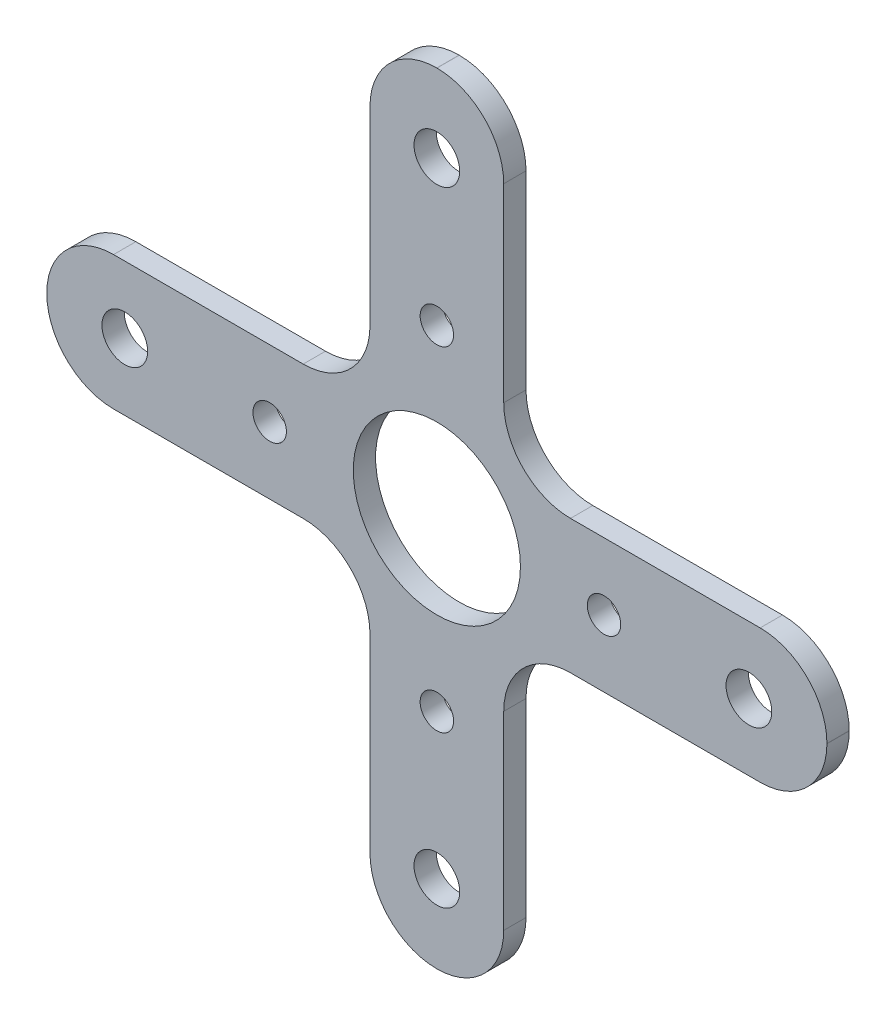
ISO-10303-21;
HEADER;
FILE_DESCRIPTION(('STEP AP214'),'2;1');
FILE_NAME('part.step','',(''),(''),'','','');
FILE_SCHEMA(('AUTOMOTIVE_DESIGN { 1 0 10303 214 1 1 1 1 }'));
ENDSEC;
DATA;
#1=APPLICATION_CONTEXT('core data for automotive mechanical design processes');
#2=APPLICATION_PROTOCOL_DEFINITION('international standard','automotive_design',2000,#1);
#3=PRODUCT_CONTEXT('',#1,'mechanical');
#4=PRODUCT('Part','Part','',(#3));
#5=PRODUCT_RELATED_PRODUCT_CATEGORY('part','',(#4));
#6=PRODUCT_DEFINITION_FORMATION('','',#4);
#7=PRODUCT_DEFINITION_CONTEXT('part definition',#1,'design');
#8=PRODUCT_DEFINITION('design','',#6,#7);
#9=PRODUCT_DEFINITION_SHAPE('','',#8);
#10=(LENGTH_UNIT() NAMED_UNIT(*) SI_UNIT(.MILLI.,.METRE.));
#11=(NAMED_UNIT(*) PLANE_ANGLE_UNIT() SI_UNIT($,.RADIAN.));
#12=(NAMED_UNIT(*) SI_UNIT($,.STERADIAN.) SOLID_ANGLE_UNIT());
#13=UNCERTAINTY_MEASURE_WITH_UNIT(LENGTH_MEASURE(1.E-05),#10,'distance_accuracy_value','');
#14=(GEOMETRIC_REPRESENTATION_CONTEXT(3) GLOBAL_UNCERTAINTY_ASSIGNED_CONTEXT((#13)) GLOBAL_UNIT_ASSIGNED_CONTEXT((#10,
#11,#12)) REPRESENTATION_CONTEXT('',''));
#15=CARTESIAN_POINT('',(0.,0.,0.));
#16=DIRECTION('',(0.,0.,1.));
#17=DIRECTION('',(1.,0.,0.));
#18=AXIS2_PLACEMENT_3D('',#15,#16,#17);
#19=CARTESIAN_POINT('',(-0.00999999999999612,29.01,2.));
#20=DIRECTION('',(0.,0.,1.));
#21=DIRECTION('',(1.,0.,0.));
#22=AXIS2_PLACEMENT_3D('',#19,#20,#21);
#23=PLANE('',#22);
#24=CARTESIAN_POINT('',(-15.,0.,2.));
#25=DIRECTION('',(0.,0.,1.));
#26=DIRECTION('',(1.,0.,0.));
#27=AXIS2_PLACEMENT_3D('',#24,#25,#26);
#28=CIRCLE('',#27,1.5);
#29=CARTESIAN_POINT('',(-13.5,0.,2.));
#30=VERTEX_POINT('',#29);
#31=EDGE_CURVE('E473',#30,#30,#28,.T.);
#32=ORIENTED_EDGE('',*,*,#31,.F.);
#33=EDGE_LOOP('',(#32));
#34=FACE_BOUND('',#33,.T.);
#35=CARTESIAN_POINT('',(0.,15.,2.));
#36=DIRECTION('',(0.,0.,1.));
#37=DIRECTION('',(1.,0.,0.));
#38=AXIS2_PLACEMENT_3D('',#35,#36,#37);
#39=CIRCLE('',#38,1.5);
#40=CARTESIAN_POINT('',(1.5,15.,2.));
#41=VERTEX_POINT('',#40);
#42=EDGE_CURVE('E485',#41,#41,#39,.T.);
#43=ORIENTED_EDGE('',*,*,#42,.F.);
#44=EDGE_LOOP('',(#43));
#45=FACE_BOUND('',#44,.T.);
#46=CARTESIAN_POINT('',(28.,0.,2.));
#47=DIRECTION('',(0.,0.,1.));
#48=DIRECTION('',(-1.,0.,0.));
#49=AXIS2_PLACEMENT_3D('',#46,#47,#48);
#50=CIRCLE('',#49,2.05);
#51=CARTESIAN_POINT('',(25.95,0.,2.));
#52=VERTEX_POINT('',#51);
#53=EDGE_CURVE('E497',#52,#52,#50,.T.);
#54=ORIENTED_EDGE('',*,*,#53,.F.);
#55=EDGE_LOOP('',(#54));
#56=FACE_BOUND('',#55,.T.);
#57=CARTESIAN_POINT('',(-28.,0.,2.));
#58=DIRECTION('',(0.,0.,1.));
#59=DIRECTION('',(1.,0.,0.));
#60=AXIS2_PLACEMENT_3D('',#57,#58,#59);
#61=CIRCLE('',#60,2.05);
#62=CARTESIAN_POINT('',(-25.95,0.,2.));
#63=VERTEX_POINT('',#62);
#64=EDGE_CURVE('E509',#63,#63,#61,.T.);
#65=ORIENTED_EDGE('',*,*,#64,.F.);
#66=EDGE_LOOP('',(#65));
#67=FACE_BOUND('',#66,.T.);
#68=CARTESIAN_POINT('',(-0.00999999999999612,29.01,2.));
#69=DIRECTION('',(0.,0.,1.));
#70=DIRECTION('',(1.,0.,0.));
#71=AXIS2_PLACEMENT_3D('',#68,#69,#70);
#72=CIRCLE('',#71,5.99);
#73=CARTESIAN_POINT('',(-0.00999999999999612,35.,2.));
#74=VERTEX_POINT('',#73);
#75=CARTESIAN_POINT('',(-6.,29.01,2.));
#76=VERTEX_POINT('',#75);
#77=EDGE_CURVE('E279',#74,#76,#72,.T.);
#78=ORIENTED_EDGE('',*,*,#77,.T.);
#79=DIRECTION('',(0.,-1.,0.));
#80=VECTOR('',#79,1.);
#81=CARTESIAN_POINT('',(-6.,11.99,2.));
#82=LINE('',#81,#80);
#83=CARTESIAN_POINT('',(-6.,11.99,2.));
#84=VERTEX_POINT('',#83);
#85=EDGE_CURVE('E147',#76,#84,#82,.T.);
#86=ORIENTED_EDGE('',*,*,#85,.T.);
#87=CARTESIAN_POINT('',(-11.99,11.99,2.));
#88=DIRECTION('',(0.,0.,-1.));
#89=DIRECTION('',(1.,0.,0.));
#90=AXIS2_PLACEMENT_3D('',#87,#88,#89);
#91=CIRCLE('',#90,5.99);
#92=CARTESIAN_POINT('',(-11.99,6.,2.));
#93=VERTEX_POINT('',#92);
#94=EDGE_CURVE('E342',#84,#93,#91,.T.);
#95=ORIENTED_EDGE('',*,*,#94,.T.);
#96=DIRECTION('',(-1.,0.,0.));
#97=VECTOR('',#96,1.);
#98=CARTESIAN_POINT('',(-29.01,6.,2.));
#99=LINE('',#98,#97);
#100=CARTESIAN_POINT('',(-29.01,6.,2.));
#101=VERTEX_POINT('',#100);
#102=EDGE_CURVE('E361',#93,#101,#99,.T.);
#103=ORIENTED_EDGE('',*,*,#102,.T.);
#104=CARTESIAN_POINT('',(-29.01,0.00999999999999959,2.));
#105=DIRECTION('',(0.,0.,1.));
#106=DIRECTION('',(-1.,0.,0.));
#107=AXIS2_PLACEMENT_3D('',#104,#105,#106);
#108=CIRCLE('',#107,5.99);
#109=CARTESIAN_POINT('',(-35.,0.00999999999999959,2.));
#110=VERTEX_POINT('',#109);
#111=EDGE_CURVE('E358',#101,#110,#108,.T.);
#112=ORIENTED_EDGE('',*,*,#111,.T.);
#113=DIRECTION('',(3.46944695195361E-13,-1.,0.));
#114=VECTOR('',#113,1.);
#115=CARTESIAN_POINT('',(-35.,-0.0100000000000005,2.));
#116=LINE('',#115,#114);
#117=CARTESIAN_POINT('',(-35.,-0.0100000000000005,2.));
#118=VERTEX_POINT('',#117);
#119=EDGE_CURVE('E360',#110,#118,#116,.T.);
#120=ORIENTED_EDGE('',*,*,#119,.T.);
#121=CARTESIAN_POINT('',(-29.01,-0.0100000000000005,2.));
#122=DIRECTION('',(0.,0.,1.));
#123=DIRECTION('',(-1.,0.,0.));
#124=AXIS2_PLACEMENT_3D('',#121,#122,#123);
#125=CIRCLE('',#124,5.99);
#126=CARTESIAN_POINT('',(-29.01,-6.,2.));
#127=VERTEX_POINT('',#126);
#128=EDGE_CURVE('E363',#118,#127,#125,.T.);
#129=ORIENTED_EDGE('',*,*,#128,.T.);
#130=DIRECTION('',(1.,0.,0.));
#131=VECTOR('',#130,1.);
#132=CARTESIAN_POINT('',(-29.01,-6.,2.));
#133=LINE('',#132,#131);
#134=CARTESIAN_POINT('',(-11.99,-6.,2.));
#135=VERTEX_POINT('',#134);
#136=EDGE_CURVE('E369',#127,#135,#133,.T.);
#137=ORIENTED_EDGE('',*,*,#136,.T.);
#138=CARTESIAN_POINT('',(-11.99,-11.99,2.));
#139=DIRECTION('',(0.,0.,-1.));
#140=DIRECTION('',(1.,0.,0.));
#141=AXIS2_PLACEMENT_3D('',#138,#139,#140);
#142=CIRCLE('',#141,5.99);
#143=CARTESIAN_POINT('',(-6.,-11.99,2.));
#144=VERTEX_POINT('',#143);
#145=EDGE_CURVE('E371',#135,#144,#142,.T.);
#146=ORIENTED_EDGE('',*,*,#145,.T.);
#147=DIRECTION('',(0.,-1.,0.));
#148=VECTOR('',#147,1.);
#149=CARTESIAN_POINT('',(-6.,-29.01,2.));
#150=LINE('',#149,#148);
#151=CARTESIAN_POINT('',(-6.,-29.01,2.));
#152=VERTEX_POINT('',#151);
#153=EDGE_CURVE('E373',#144,#152,#150,.T.);
#154=ORIENTED_EDGE('',*,*,#153,.T.);
#155=CARTESIAN_POINT('',(-0.00999999999999612,-29.01,2.));
#156=DIRECTION('',(0.,0.,1.));
#157=DIRECTION('',(-1.,0.,0.));
#158=AXIS2_PLACEMENT_3D('',#155,#156,#157);
#159=CIRCLE('',#158,5.99);
#160=CARTESIAN_POINT('',(-0.00999999999999612,-35.,2.));
#161=VERTEX_POINT('',#160);
#162=EDGE_CURVE('E375',#152,#161,#159,.T.);
#163=ORIENTED_EDGE('',*,*,#162,.T.);
#164=DIRECTION('',(1.,0.,0.));
#165=VECTOR('',#164,1.);
#166=CARTESIAN_POINT('',(-0.00999999999999612,-35.,2.));
#167=LINE('',#166,#165);
#168=CARTESIAN_POINT('',(0.010000000000002,-35.,2.));
#169=VERTEX_POINT('',#168);
#170=EDGE_CURVE('E377',#161,#169,#167,.T.);
#171=ORIENTED_EDGE('',*,*,#170,.T.);
#172=CARTESIAN_POINT('',(0.0100000000000031,-29.01,2.));
#173=DIRECTION('',(0.,0.,1.));
#174=DIRECTION('',(1.,0.,0.));
#175=AXIS2_PLACEMENT_3D('',#172,#173,#174);
#176=CIRCLE('',#175,5.99);
#177=CARTESIAN_POINT('',(6.,-29.01,2.));
#178=VERTEX_POINT('',#177);
#179=EDGE_CURVE('E379',#169,#178,#176,.T.);
#180=ORIENTED_EDGE('',*,*,#179,.T.);
#181=DIRECTION('',(0.,1.,0.));
#182=VECTOR('',#181,1.);
#183=CARTESIAN_POINT('',(6.,-29.01,2.));
#184=LINE('',#183,#182);
#185=CARTESIAN_POINT('',(6.,-11.99,2.));
#186=VERTEX_POINT('',#185);
#187=EDGE_CURVE('E381',#178,#186,#184,.T.);
#188=ORIENTED_EDGE('',*,*,#187,.T.);
#189=CARTESIAN_POINT('',(11.99,-11.99,2.));
#190=DIRECTION('',(0.,0.,-1.));
#191=DIRECTION('',(-1.,0.,0.));
#192=AXIS2_PLACEMENT_3D('',#189,#190,#191);
#193=CIRCLE('',#192,5.99);
#194=CARTESIAN_POINT('',(11.99,-6.,2.));
#195=VERTEX_POINT('',#194);
#196=EDGE_CURVE('E383',#186,#195,#193,.T.);
#197=ORIENTED_EDGE('',*,*,#196,.T.);
#198=DIRECTION('',(1.,0.,0.));
#199=VECTOR('',#198,1.);
#200=CARTESIAN_POINT('',(11.99,-6.,2.));
#201=LINE('',#200,#199);
#202=CARTESIAN_POINT('',(29.01,-6.,2.));
#203=VERTEX_POINT('',#202);
#204=EDGE_CURVE('E385',#195,#203,#201,.T.);
#205=ORIENTED_EDGE('',*,*,#204,.T.);
#206=CARTESIAN_POINT('',(29.01,-0.0100000000000005,2.));
#207=DIRECTION('',(0.,0.,1.));
#208=DIRECTION('',(1.,0.,0.));
#209=AXIS2_PLACEMENT_3D('',#206,#207,#208);
#210=CIRCLE('',#209,5.99);
#211=CARTESIAN_POINT('',(35.,-0.0100000000000005,2.));
#212=VERTEX_POINT('',#211);
#213=EDGE_CURVE('E387',#203,#212,#210,.T.);
#214=ORIENTED_EDGE('',*,*,#213,.T.);
#215=DIRECTION('',(0.,1.,0.));
#216=VECTOR('',#215,1.);
#217=CARTESIAN_POINT('',(35.,-0.0100000000000005,2.));
#218=LINE('',#217,#216);
#219=CARTESIAN_POINT('',(35.,0.00999999999999959,2.));
#220=VERTEX_POINT('',#219);
#221=EDGE_CURVE('E389',#212,#220,#218,.T.);
#222=ORIENTED_EDGE('',*,*,#221,.T.);
#223=CARTESIAN_POINT('',(29.01,0.00999999999999959,2.));
#224=DIRECTION('',(0.,0.,1.));
#225=DIRECTION('',(1.,0.,0.));
#226=AXIS2_PLACEMENT_3D('',#223,#224,#225);
#227=CIRCLE('',#226,5.99);
#228=CARTESIAN_POINT('',(29.01,6.,2.));
#229=VERTEX_POINT('',#228);
#230=EDGE_CURVE('E391',#220,#229,#227,.T.);
#231=ORIENTED_EDGE('',*,*,#230,.T.);
#232=DIRECTION('',(-1.,0.,0.));
#233=VECTOR('',#232,1.);
#234=CARTESIAN_POINT('',(11.99,6.,2.));
#235=LINE('',#234,#233);
#236=CARTESIAN_POINT('',(11.99,6.,2.));
#237=VERTEX_POINT('',#236);
#238=EDGE_CURVE('E393',#229,#237,#235,.T.);
#239=ORIENTED_EDGE('',*,*,#238,.T.);
#240=CARTESIAN_POINT('',(11.99,11.99,2.));
#241=DIRECTION('',(0.,0.,-1.));
#242=DIRECTION('',(-1.,0.,0.));
#243=AXIS2_PLACEMENT_3D('',#240,#241,#242);
#244=CIRCLE('',#243,5.99);
#245=CARTESIAN_POINT('',(6.,11.99,2.));
#246=VERTEX_POINT('',#245);
#247=EDGE_CURVE('E214',#237,#246,#244,.T.);
#248=ORIENTED_EDGE('',*,*,#247,.T.);
#249=DIRECTION('',(0.,1.,0.));
#250=VECTOR('',#249,1.);
#251=CARTESIAN_POINT('',(6.,11.99,2.));
#252=LINE('',#251,#250);
#253=CARTESIAN_POINT('',(6.,29.01,2.));
#254=VERTEX_POINT('',#253);
#255=EDGE_CURVE('E208',#246,#254,#252,.T.);
#256=ORIENTED_EDGE('',*,*,#255,.T.);
#257=CARTESIAN_POINT('',(0.0100000000000031,29.01,2.));
#258=DIRECTION('',(0.,0.,1.));
#259=DIRECTION('',(-1.,0.,0.));
#260=AXIS2_PLACEMENT_3D('',#257,#258,#259);
#261=CIRCLE('',#260,5.99);
#262=CARTESIAN_POINT('',(0.0100000000000031,35.,2.));
#263=VERTEX_POINT('',#262);
#264=EDGE_CURVE('E212',#254,#263,#261,.T.);
#265=ORIENTED_EDGE('',*,*,#264,.T.);
#266=DIRECTION('',(-1.,0.,0.));
#267=VECTOR('',#266,1.);
#268=CARTESIAN_POINT('',(-0.00999999999999612,35.,2.));
#269=LINE('',#268,#267);
#270=EDGE_CURVE('E56',#263,#74,#269,.T.);
#271=ORIENTED_EDGE('',*,*,#270,.T.);
#272=EDGE_LOOP('',(#78,#86,#95,#103,#112,#120,#129,#137,#146,#154,#163,#171,#180,#188,#197,#205,
#214,#222,#231,#239,#248,#256,#265,#271));
#273=FACE_BOUND('',#272,.T.);
#274=CARTESIAN_POINT('',(0.,0.,2.));
#275=DIRECTION('',(0.,0.,1.));
#276=DIRECTION('',(1.,0.,0.));
#277=AXIS2_PLACEMENT_3D('',#274,#275,#276);
#278=CIRCLE('',#277,7.5);
#279=CARTESIAN_POINT('',(7.5,0.,2.));
#280=VERTEX_POINT('',#279);
#281=EDGE_CURVE('E236',#280,#280,#278,.T.);
#282=ORIENTED_EDGE('',*,*,#281,.F.);
#283=EDGE_LOOP('',(#282));
#284=FACE_BOUND('',#283,.T.);
#285=CARTESIAN_POINT('',(0.,-28.,2.));
#286=DIRECTION('',(0.,0.,1.));
#287=DIRECTION('',(-1.,0.,0.));
#288=AXIS2_PLACEMENT_3D('',#285,#286,#287);
#289=CIRCLE('',#288,2.05);
#290=CARTESIAN_POINT('',(-2.05,-28.,2.));
#291=VERTEX_POINT('',#290);
#292=EDGE_CURVE('E503',#291,#291,#289,.T.);
#293=ORIENTED_EDGE('',*,*,#292,.F.);
#294=EDGE_LOOP('',(#293));
#295=FACE_BOUND('',#294,.T.);
#296=CARTESIAN_POINT('',(0.,28.,2.));
#297=DIRECTION('',(0.,0.,1.));
#298=DIRECTION('',(1.,0.,0.));
#299=AXIS2_PLACEMENT_3D('',#296,#297,#298);
#300=CIRCLE('',#299,2.05);
#301=CARTESIAN_POINT('',(2.05,28.,2.));
#302=VERTEX_POINT('',#301);
#303=EDGE_CURVE('E491',#302,#302,#300,.T.);
#304=ORIENTED_EDGE('',*,*,#303,.F.);
#305=EDGE_LOOP('',(#304));
#306=FACE_BOUND('',#305,.T.);
#307=CARTESIAN_POINT('',(0.,-15.,2.));
#308=DIRECTION('',(0.,0.,1.));
#309=DIRECTION('',(-1.,0.,0.));
#310=AXIS2_PLACEMENT_3D('',#307,#308,#309);
#311=CIRCLE('',#310,1.5);
#312=CARTESIAN_POINT('',(-1.5,-15.,2.));
#313=VERTEX_POINT('',#312);
#314=EDGE_CURVE('E479',#313,#313,#311,.T.);
#315=ORIENTED_EDGE('',*,*,#314,.F.);
#316=EDGE_LOOP('',(#315));
#317=FACE_BOUND('',#316,.T.);
#318=CARTESIAN_POINT('',(15.,0.,2.));
#319=DIRECTION('',(0.,0.,1.));
#320=DIRECTION('',(-1.,0.,0.));
#321=AXIS2_PLACEMENT_3D('',#318,#319,#320);
#322=CIRCLE('',#321,1.5);
#323=CARTESIAN_POINT('',(13.5,0.,2.));
#324=VERTEX_POINT('',#323);
#325=EDGE_CURVE('E464',#324,#324,#322,.T.);
#326=ORIENTED_EDGE('',*,*,#325,.F.);
#327=EDGE_LOOP('',(#326));
#328=FACE_BOUND('',#327,.T.);
#329=ADVANCED_FACE('F39',(#34,#45,#56,#67,#273,#284,#295,#306,#317,#328),#23,.T.);
#330=CARTESIAN_POINT('',(-0.00999999999999612,29.01,0.));
#331=DIRECTION('',(0.,0.,1.));
#332=DIRECTION('',(1.,0.,0.));
#333=AXIS2_PLACEMENT_3D('',#330,#331,#332);
#334=PLANE('',#333);
#335=CARTESIAN_POINT('',(-0.00999999999999612,29.01,0.));
#336=DIRECTION('',(0.,0.,1.));
#337=DIRECTION('',(1.,0.,0.));
#338=AXIS2_PLACEMENT_3D('',#335,#336,#337);
#339=CIRCLE('',#338,5.99);
#340=CARTESIAN_POINT('',(-0.00999999999999612,35.,0.));
#341=VERTEX_POINT('',#340);
#342=CARTESIAN_POINT('',(-6.,29.01,0.));
#343=VERTEX_POINT('',#342);
#344=EDGE_CURVE('E232',#341,#343,#339,.T.);
#345=ORIENTED_EDGE('',*,*,#344,.F.);
#346=DIRECTION('',(-1.,0.,0.));
#347=VECTOR('',#346,1.);
#348=CARTESIAN_POINT('',(-0.00999999999999612,35.,0.));
#349=LINE('',#348,#347);
#350=CARTESIAN_POINT('',(0.0100000000000031,35.,0.));
#351=VERTEX_POINT('',#350);
#352=EDGE_CURVE('E139',#351,#341,#349,.T.);
#353=ORIENTED_EDGE('',*,*,#352,.F.);
#354=CARTESIAN_POINT('',(0.0100000000000031,29.01,0.));
#355=DIRECTION('',(0.,0.,1.));
#356=DIRECTION('',(-1.,0.,0.));
#357=AXIS2_PLACEMENT_3D('',#354,#355,#356);
#358=CIRCLE('',#357,5.99);
#359=CARTESIAN_POINT('',(6.,29.01,0.));
#360=VERTEX_POINT('',#359);
#361=EDGE_CURVE('E133',#360,#351,#358,.T.);
#362=ORIENTED_EDGE('',*,*,#361,.F.);
#363=DIRECTION('',(0.,1.,0.));
#364=VECTOR('',#363,1.);
#365=CARTESIAN_POINT('',(6.,11.99,0.));
#366=LINE('',#365,#364);
#367=CARTESIAN_POINT('',(6.,11.99,0.));
#368=VERTEX_POINT('',#367);
#369=EDGE_CURVE('E222',#368,#360,#366,.T.);
#370=ORIENTED_EDGE('',*,*,#369,.F.);
#371=CARTESIAN_POINT('',(11.99,11.99,0.));
#372=DIRECTION('',(0.,0.,-1.));
#373=DIRECTION('',(-1.,0.,0.));
#374=AXIS2_PLACEMENT_3D('',#371,#372,#373);
#375=CIRCLE('',#374,5.99);
#376=CARTESIAN_POINT('',(11.99,6.,0.));
#377=VERTEX_POINT('',#376);
#378=EDGE_CURVE('E274',#377,#368,#375,.T.);
#379=ORIENTED_EDGE('',*,*,#378,.F.);
#380=DIRECTION('',(-1.,0.,0.));
#381=VECTOR('',#380,1.);
#382=CARTESIAN_POINT('',(11.99,6.,0.));
#383=LINE('',#382,#381);
#384=CARTESIAN_POINT('',(29.01,6.,0.));
#385=VERTEX_POINT('',#384);
#386=EDGE_CURVE('E272',#385,#377,#383,.T.);
#387=ORIENTED_EDGE('',*,*,#386,.F.);
#388=CARTESIAN_POINT('',(29.01,0.00999999999999959,0.));
#389=DIRECTION('',(0.,0.,1.));
#390=DIRECTION('',(1.,0.,0.));
#391=AXIS2_PLACEMENT_3D('',#388,#389,#390);
#392=CIRCLE('',#391,5.99);
#393=CARTESIAN_POINT('',(35.,0.00999999999999959,0.));
#394=VERTEX_POINT('',#393);
#395=EDGE_CURVE('E270',#394,#385,#392,.T.);
#396=ORIENTED_EDGE('',*,*,#395,.F.);
#397=DIRECTION('',(0.,1.,0.));
#398=VECTOR('',#397,1.);
#399=CARTESIAN_POINT('',(35.,-0.0100000000000005,0.));
#400=LINE('',#399,#398);
#401=CARTESIAN_POINT('',(35.,-0.0100000000000005,0.));
#402=VERTEX_POINT('',#401);
#403=EDGE_CURVE('E268',#402,#394,#400,.T.);
#404=ORIENTED_EDGE('',*,*,#403,.F.);
#405=CARTESIAN_POINT('',(29.01,-0.0100000000000005,0.));
#406=DIRECTION('',(0.,0.,1.));
#407=DIRECTION('',(1.,0.,0.));
#408=AXIS2_PLACEMENT_3D('',#405,#406,#407);
#409=CIRCLE('',#408,5.99);
#410=CARTESIAN_POINT('',(29.01,-6.,0.));
#411=VERTEX_POINT('',#410);
#412=EDGE_CURVE('E266',#411,#402,#409,.T.);
#413=ORIENTED_EDGE('',*,*,#412,.F.);
#414=DIRECTION('',(1.,0.,0.));
#415=VECTOR('',#414,1.);
#416=CARTESIAN_POINT('',(11.99,-6.,0.));
#417=LINE('',#416,#415);
#418=CARTESIAN_POINT('',(11.99,-6.,0.));
#419=VERTEX_POINT('',#418);
#420=EDGE_CURVE('E264',#419,#411,#417,.T.);
#421=ORIENTED_EDGE('',*,*,#420,.F.);
#422=CARTESIAN_POINT('',(11.99,-11.99,0.));
#423=DIRECTION('',(0.,0.,-1.));
#424=DIRECTION('',(-1.,0.,0.));
#425=AXIS2_PLACEMENT_3D('',#422,#423,#424);
#426=CIRCLE('',#425,5.99);
#427=CARTESIAN_POINT('',(6.,-11.99,0.));
#428=VERTEX_POINT('',#427);
#429=EDGE_CURVE('E262',#428,#419,#426,.T.);
#430=ORIENTED_EDGE('',*,*,#429,.F.);
#431=DIRECTION('',(0.,1.,0.));
#432=VECTOR('',#431,1.);
#433=CARTESIAN_POINT('',(6.,-29.01,0.));
#434=LINE('',#433,#432);
#435=CARTESIAN_POINT('',(6.,-29.01,0.));
#436=VERTEX_POINT('',#435);
#437=EDGE_CURVE('E260',#436,#428,#434,.T.);
#438=ORIENTED_EDGE('',*,*,#437,.F.);
#439=CARTESIAN_POINT('',(0.0100000000000031,-29.01,0.));
#440=DIRECTION('',(0.,0.,1.));
#441=DIRECTION('',(1.,0.,0.));
#442=AXIS2_PLACEMENT_3D('',#439,#440,#441);
#443=CIRCLE('',#442,5.99);
#444=CARTESIAN_POINT('',(0.010000000000002,-35.,0.));
#445=VERTEX_POINT('',#444);
#446=EDGE_CURVE('E258',#445,#436,#443,.T.);
#447=ORIENTED_EDGE('',*,*,#446,.F.);
#448=DIRECTION('',(1.,0.,0.));
#449=VECTOR('',#448,1.);
#450=CARTESIAN_POINT('',(-0.00999999999999612,-35.,0.));
#451=LINE('',#450,#449);
#452=CARTESIAN_POINT('',(-0.00999999999999612,-35.,0.));
#453=VERTEX_POINT('',#452);
#454=EDGE_CURVE('E256',#453,#445,#451,.T.);
#455=ORIENTED_EDGE('',*,*,#454,.F.);
#456=CARTESIAN_POINT('',(-0.00999999999999612,-29.01,0.));
#457=DIRECTION('',(0.,0.,1.));
#458=DIRECTION('',(-1.,0.,0.));
#459=AXIS2_PLACEMENT_3D('',#456,#457,#458);
#460=CIRCLE('',#459,5.99);
#461=CARTESIAN_POINT('',(-6.,-29.01,0.));
#462=VERTEX_POINT('',#461);
#463=EDGE_CURVE('E254',#462,#453,#460,.T.);
#464=ORIENTED_EDGE('',*,*,#463,.F.);
#465=DIRECTION('',(0.,-1.,0.));
#466=VECTOR('',#465,1.);
#467=CARTESIAN_POINT('',(-6.,-29.01,0.));
#468=LINE('',#467,#466);
#469=CARTESIAN_POINT('',(-6.,-11.99,0.));
#470=VERTEX_POINT('',#469);
#471=EDGE_CURVE('E252',#470,#462,#468,.T.);
#472=ORIENTED_EDGE('',*,*,#471,.F.);
#473=CARTESIAN_POINT('',(-11.99,-11.99,0.));
#474=DIRECTION('',(0.,0.,-1.));
#475=DIRECTION('',(1.,0.,0.));
#476=AXIS2_PLACEMENT_3D('',#473,#474,#475);
#477=CIRCLE('',#476,5.99);
#478=CARTESIAN_POINT('',(-11.99,-6.,0.));
#479=VERTEX_POINT('',#478);
#480=EDGE_CURVE('E250',#479,#470,#477,.T.);
#481=ORIENTED_EDGE('',*,*,#480,.F.);
#482=DIRECTION('',(1.,0.,0.));
#483=VECTOR('',#482,1.);
#484=CARTESIAN_POINT('',(-29.01,-6.,0.));
#485=LINE('',#484,#483);
#486=CARTESIAN_POINT('',(-29.01,-6.,0.));
#487=VERTEX_POINT('',#486);
#488=EDGE_CURVE('E248',#487,#479,#485,.T.);
#489=ORIENTED_EDGE('',*,*,#488,.F.);
#490=CARTESIAN_POINT('',(-29.01,-0.0100000000000005,0.));
#491=DIRECTION('',(0.,0.,1.));
#492=DIRECTION('',(-1.,0.,0.));
#493=AXIS2_PLACEMENT_3D('',#490,#491,#492);
#494=CIRCLE('',#493,5.99);
#495=CARTESIAN_POINT('',(-35.,-0.0100000000000005,0.));
#496=VERTEX_POINT('',#495);
#497=EDGE_CURVE('E246',#496,#487,#494,.T.);
#498=ORIENTED_EDGE('',*,*,#497,.F.);
#499=DIRECTION('',(3.46944695195361E-13,-1.,0.));
#500=VECTOR('',#499,1.);
#501=CARTESIAN_POINT('',(-35.,-0.0100000000000005,0.));
#502=LINE('',#501,#500);
#503=CARTESIAN_POINT('',(-35.,0.00999999999999959,0.));
#504=VERTEX_POINT('',#503);
#505=EDGE_CURVE('E244',#504,#496,#502,.T.);
#506=ORIENTED_EDGE('',*,*,#505,.F.);
#507=CARTESIAN_POINT('',(-29.01,0.00999999999999959,0.));
#508=DIRECTION('',(0.,0.,1.));
#509=DIRECTION('',(-1.,0.,0.));
#510=AXIS2_PLACEMENT_3D('',#507,#508,#509);
#511=CIRCLE('',#510,5.99);
#512=CARTESIAN_POINT('',(-29.01,6.,0.));
#513=VERTEX_POINT('',#512);
#514=EDGE_CURVE('E242',#513,#504,#511,.T.);
#515=ORIENTED_EDGE('',*,*,#514,.F.);
#516=DIRECTION('',(-1.,0.,0.));
#517=VECTOR('',#516,1.);
#518=CARTESIAN_POINT('',(-29.01,6.,0.));
#519=LINE('',#518,#517);
#520=CARTESIAN_POINT('',(-11.99,6.,0.));
#521=VERTEX_POINT('',#520);
#522=EDGE_CURVE('E240',#521,#513,#519,.T.);
#523=ORIENTED_EDGE('',*,*,#522,.F.);
#524=CARTESIAN_POINT('',(-11.99,11.99,0.));
#525=DIRECTION('',(0.,0.,-1.));
#526=DIRECTION('',(1.,0.,0.));
#527=AXIS2_PLACEMENT_3D('',#524,#525,#526);
#528=CIRCLE('',#527,5.99);
#529=CARTESIAN_POINT('',(-6.,11.99,0.));
#530=VERTEX_POINT('',#529);
#531=EDGE_CURVE('E238',#530,#521,#528,.T.);
#532=ORIENTED_EDGE('',*,*,#531,.F.);
#533=DIRECTION('',(0.,-1.,0.));
#534=VECTOR('',#533,1.);
#535=CARTESIAN_POINT('',(-6.,11.99,0.));
#536=LINE('',#535,#534);
#537=EDGE_CURVE('E235',#343,#530,#536,.T.);
#538=ORIENTED_EDGE('',*,*,#537,.F.);
#539=EDGE_LOOP('',(#345,#353,#362,#370,#379,#387,#396,#404,#413,#421,#430,#438,#447,#455,#464,
#472,#481,#489,#498,#506,#515,#523,#532,#538));
#540=FACE_BOUND('',#539,.T.);
#541=CARTESIAN_POINT('',(0.,0.,0.));
#542=DIRECTION('',(0.,0.,1.));
#543=DIRECTION('',(1.,0.,0.));
#544=AXIS2_PLACEMENT_3D('',#541,#542,#543);
#545=CIRCLE('',#544,7.5);
#546=CARTESIAN_POINT('',(7.5,0.,0.));
#547=VERTEX_POINT('',#546);
#548=EDGE_CURVE('E512',#547,#547,#545,.T.);
#549=ORIENTED_EDGE('',*,*,#548,.T.);
#550=EDGE_LOOP('',(#549));
#551=FACE_BOUND('',#550,.T.);
#552=CARTESIAN_POINT('',(-28.,0.,0.));
#553=DIRECTION('',(0.,0.,1.));
#554=DIRECTION('',(1.,0.,0.));
#555=AXIS2_PLACEMENT_3D('',#552,#553,#554);
#556=CIRCLE('',#555,2.05);
#557=CARTESIAN_POINT('',(-25.95,0.,0.));
#558=VERTEX_POINT('',#557);
#559=EDGE_CURVE('E506',#558,#558,#556,.T.);
#560=ORIENTED_EDGE('',*,*,#559,.T.);
#561=EDGE_LOOP('',(#560));
#562=FACE_BOUND('',#561,.T.);
#563=CARTESIAN_POINT('',(0.,-28.,0.));
#564=DIRECTION('',(0.,0.,1.));
#565=DIRECTION('',(-1.,0.,0.));
#566=AXIS2_PLACEMENT_3D('',#563,#564,#565);
#567=CIRCLE('',#566,2.05);
#568=CARTESIAN_POINT('',(-2.05,-28.,0.));
#569=VERTEX_POINT('',#568);
#570=EDGE_CURVE('E500',#569,#569,#567,.T.);
#571=ORIENTED_EDGE('',*,*,#570,.T.);
#572=EDGE_LOOP('',(#571));
#573=FACE_BOUND('',#572,.T.);
#574=CARTESIAN_POINT('',(28.,0.,0.));
#575=DIRECTION('',(0.,0.,1.));
#576=DIRECTION('',(-1.,0.,0.));
#577=AXIS2_PLACEMENT_3D('',#574,#575,#576);
#578=CIRCLE('',#577,2.05);
#579=CARTESIAN_POINT('',(25.95,0.,0.));
#580=VERTEX_POINT('',#579);
#581=EDGE_CURVE('E494',#580,#580,#578,.T.);
#582=ORIENTED_EDGE('',*,*,#581,.T.);
#583=EDGE_LOOP('',(#582));
#584=FACE_BOUND('',#583,.T.);
#585=CARTESIAN_POINT('',(0.,28.,0.));
#586=DIRECTION('',(0.,0.,1.));
#587=DIRECTION('',(1.,0.,0.));
#588=AXIS2_PLACEMENT_3D('',#585,#586,#587);
#589=CIRCLE('',#588,2.05);
#590=CARTESIAN_POINT('',(2.05,28.,0.));
#591=VERTEX_POINT('',#590);
#592=EDGE_CURVE('E488',#591,#591,#589,.T.);
#593=ORIENTED_EDGE('',*,*,#592,.T.);
#594=EDGE_LOOP('',(#593));
#595=FACE_BOUND('',#594,.T.);
#596=CARTESIAN_POINT('',(0.,15.,0.));
#597=DIRECTION('',(0.,0.,1.));
#598=DIRECTION('',(1.,0.,0.));
#599=AXIS2_PLACEMENT_3D('',#596,#597,#598);
#600=CIRCLE('',#599,1.5);
#601=CARTESIAN_POINT('',(1.5,15.,0.));
#602=VERTEX_POINT('',#601);
#603=EDGE_CURVE('E482',#602,#602,#600,.T.);
#604=ORIENTED_EDGE('',*,*,#603,.T.);
#605=EDGE_LOOP('',(#604));
#606=FACE_BOUND('',#605,.T.);
#607=CARTESIAN_POINT('',(0.,-15.,0.));
#608=DIRECTION('',(0.,0.,1.));
#609=DIRECTION('',(-1.,0.,0.));
#610=AXIS2_PLACEMENT_3D('',#607,#608,#609);
#611=CIRCLE('',#610,1.5);
#612=CARTESIAN_POINT('',(-1.5,-15.,0.));
#613=VERTEX_POINT('',#612);
#614=EDGE_CURVE('E476',#613,#613,#611,.T.);
#615=ORIENTED_EDGE('',*,*,#614,.T.);
#616=EDGE_LOOP('',(#615));
#617=FACE_BOUND('',#616,.T.);
#618=CARTESIAN_POINT('',(-15.,0.,0.));
#619=DIRECTION('',(0.,0.,1.));
#620=DIRECTION('',(1.,0.,0.));
#621=AXIS2_PLACEMENT_3D('',#618,#619,#620);
#622=CIRCLE('',#621,1.5);
#623=CARTESIAN_POINT('',(-13.5,0.,0.));
#624=VERTEX_POINT('',#623);
#625=EDGE_CURVE('E470',#624,#624,#622,.T.);
#626=ORIENTED_EDGE('',*,*,#625,.T.);
#627=EDGE_LOOP('',(#626));
#628=FACE_BOUND('',#627,.T.);
#629=CARTESIAN_POINT('',(15.,0.,0.));
#630=DIRECTION('',(0.,0.,1.));
#631=DIRECTION('',(-1.,0.,0.));
#632=AXIS2_PLACEMENT_3D('',#629,#630,#631);
#633=CIRCLE('',#632,1.5);
#634=CARTESIAN_POINT('',(13.5,0.,0.));
#635=VERTEX_POINT('',#634);
#636=EDGE_CURVE('E467',#635,#635,#633,.T.);
#637=ORIENTED_EDGE('',*,*,#636,.T.);
#638=EDGE_LOOP('',(#637));
#639=FACE_BOUND('',#638,.T.);
#640=ADVANCED_FACE('F346',(#540,#551,#562,#573,#584,#595,#606,#617,#628,#639),#334,.F.);
#641=CARTESIAN_POINT('',(-0.00999999999999612,29.01,2.));
#642=DIRECTION('',(0.,0.,-1.));
#643=DIRECTION('',(-1.,0.,0.));
#644=AXIS2_PLACEMENT_3D('',#641,#642,#643);
#645=CYLINDRICAL_SURFACE('',#644,5.99);
#646=ORIENTED_EDGE('',*,*,#344,.T.);
#647=DIRECTION('',(0.,0.,-1.));
#648=VECTOR('',#647,1.);
#649=CARTESIAN_POINT('',(-6.,29.01,2.));
#650=LINE('',#649,#648);
#651=EDGE_CURVE('E11',#76,#343,#650,.T.);
#652=ORIENTED_EDGE('',*,*,#651,.F.);
#653=ORIENTED_EDGE('',*,*,#77,.F.);
#654=DIRECTION('',(0.,0.,-1.));
#655=VECTOR('',#654,1.);
#656=CARTESIAN_POINT('',(-0.00999999999999612,35.,2.));
#657=LINE('',#656,#655);
#658=EDGE_CURVE('E228',#74,#341,#657,.T.);
#659=ORIENTED_EDGE('',*,*,#658,.T.);
#660=EDGE_LOOP('',(#646,#652,#653,#659));
#661=FACE_BOUND('',#660,.T.);
#662=ADVANCED_FACE('F41',(#661),#645,.T.);
#663=CARTESIAN_POINT('',(-6.,11.99,2.));
#664=DIRECTION('',(1.,0.,0.));
#665=DIRECTION('',(0.,1.,0.));
#666=AXIS2_PLACEMENT_3D('',#663,#664,#665);
#667=PLANE('',#666);
#668=ORIENTED_EDGE('',*,*,#537,.T.);
#669=DIRECTION('',(0.,0.,-1.));
#670=VECTOR('',#669,1.);
#671=CARTESIAN_POINT('',(-6.,11.99,2.));
#672=LINE('',#671,#670);
#673=EDGE_CURVE('E48',#84,#530,#672,.T.);
#674=ORIENTED_EDGE('',*,*,#673,.F.);
#675=ORIENTED_EDGE('',*,*,#85,.F.);
#676=ORIENTED_EDGE('',*,*,#651,.T.);
#677=EDGE_LOOP('',(#668,#674,#675,#676));
#678=FACE_BOUND('',#677,.T.);
#679=ADVANCED_FACE('F787',(#678),#667,.F.);
#680=CARTESIAN_POINT('',(-11.99,11.99,2.));
#681=DIRECTION('',(0.,0.,-1.));
#682=DIRECTION('',(-1.,0.,0.));
#683=AXIS2_PLACEMENT_3D('',#680,#681,#682);
#684=CYLINDRICAL_SURFACE('',#683,5.99);
#685=ORIENTED_EDGE('',*,*,#531,.T.);
#686=DIRECTION('',(0.,0.,-1.));
#687=VECTOR('',#686,1.);
#688=CARTESIAN_POINT('',(-11.99,6.,2.));
#689=LINE('',#688,#687);
#690=EDGE_CURVE('E334',#93,#521,#689,.T.);
#691=ORIENTED_EDGE('',*,*,#690,.F.);
#692=ORIENTED_EDGE('',*,*,#94,.F.);
#693=ORIENTED_EDGE('',*,*,#673,.T.);
#694=EDGE_LOOP('',(#685,#691,#692,#693));
#695=FACE_BOUND('',#694,.T.);
#696=ADVANCED_FACE('F340',(#695),#684,.F.);
#697=CARTESIAN_POINT('',(-29.01,6.,2.));
#698=DIRECTION('',(0.,-1.,0.));
#699=DIRECTION('',(1.,0.,0.));
#700=AXIS2_PLACEMENT_3D('',#697,#698,#699);
#701=PLANE('',#700);
#702=ORIENTED_EDGE('',*,*,#522,.T.);
#703=DIRECTION('',(0.,0.,-1.));
#704=VECTOR('',#703,1.);
#705=CARTESIAN_POINT('',(-29.01,6.,2.));
#706=LINE('',#705,#704);
#707=EDGE_CURVE('E331',#101,#513,#706,.T.);
#708=ORIENTED_EDGE('',*,*,#707,.F.);
#709=ORIENTED_EDGE('',*,*,#102,.F.);
#710=ORIENTED_EDGE('',*,*,#690,.T.);
#711=EDGE_LOOP('',(#702,#708,#709,#710));
#712=FACE_BOUND('',#711,.T.);
#713=ADVANCED_FACE('F352',(#712),#701,.F.);
#714=CARTESIAN_POINT('',(-29.01,0.00999999999999959,2.));
#715=DIRECTION('',(0.,0.,-1.));
#716=DIRECTION('',(-1.,0.,0.));
#717=AXIS2_PLACEMENT_3D('',#714,#715,#716);
#718=CYLINDRICAL_SURFACE('',#717,5.99);
#719=ORIENTED_EDGE('',*,*,#514,.T.);
#720=DIRECTION('',(0.,0.,-1.));
#721=VECTOR('',#720,1.);
#722=CARTESIAN_POINT('',(-35.,0.00999999999999959,2.));
#723=LINE('',#722,#721);
#724=EDGE_CURVE('E328',#110,#504,#723,.T.);
#725=ORIENTED_EDGE('',*,*,#724,.F.);
#726=ORIENTED_EDGE('',*,*,#111,.F.);
#727=ORIENTED_EDGE('',*,*,#707,.T.);
#728=EDGE_LOOP('',(#719,#725,#726,#727));
#729=FACE_BOUND('',#728,.T.);
#730=ADVANCED_FACE('F356',(#729),#718,.T.);
#731=CARTESIAN_POINT('',(-35.,-0.0100000000000005,2.));
#732=DIRECTION('',(1.,3.46944695195361E-13,0.));
#733=DIRECTION('',(-3.46944695195361E-13,1.,0.));
#734=AXIS2_PLACEMENT_3D('',#731,#732,#733);
#735=PLANE('',#734);
#736=ORIENTED_EDGE('',*,*,#505,.T.);
#737=DIRECTION('',(0.,0.,-1.));
#738=VECTOR('',#737,1.);
#739=CARTESIAN_POINT('',(-35.,-0.0100000000000005,2.));
#740=LINE('',#739,#738);
#741=EDGE_CURVE('E325',#118,#496,#740,.T.);
#742=ORIENTED_EDGE('',*,*,#741,.F.);
#743=ORIENTED_EDGE('',*,*,#119,.F.);
#744=ORIENTED_EDGE('',*,*,#724,.T.);
#745=EDGE_LOOP('',(#736,#742,#743,#744));
#746=FACE_BOUND('',#745,.T.);
#747=ADVANCED_FACE('F752',(#746),#735,.F.);
#748=CARTESIAN_POINT('',(-29.01,-0.0100000000000005,2.));
#749=DIRECTION('',(0.,0.,-1.));
#750=DIRECTION('',(-1.,0.,0.));
#751=AXIS2_PLACEMENT_3D('',#748,#749,#750);
#752=CYLINDRICAL_SURFACE('',#751,5.99);
#753=ORIENTED_EDGE('',*,*,#497,.T.);
#754=DIRECTION('',(0.,0.,-1.));
#755=VECTOR('',#754,1.);
#756=CARTESIAN_POINT('',(-29.01,-6.,2.));
#757=LINE('',#756,#755);
#758=EDGE_CURVE('E322',#127,#487,#757,.T.);
#759=ORIENTED_EDGE('',*,*,#758,.F.);
#760=ORIENTED_EDGE('',*,*,#128,.F.);
#761=ORIENTED_EDGE('',*,*,#741,.T.);
#762=EDGE_LOOP('',(#753,#759,#760,#761));
#763=FACE_BOUND('',#762,.T.);
#764=ADVANCED_FACE('F742',(#763),#752,.T.);
#765=CARTESIAN_POINT('',(-29.01,-6.,2.));
#766=DIRECTION('',(0.,1.,0.));
#767=DIRECTION('',(0.,0.,1.));
#768=AXIS2_PLACEMENT_3D('',#765,#766,#767);
#769=PLANE('',#768);
#770=ORIENTED_EDGE('',*,*,#488,.T.);
#771=DIRECTION('',(0.,0.,-1.));
#772=VECTOR('',#771,1.);
#773=CARTESIAN_POINT('',(-11.99,-6.,2.));
#774=LINE('',#773,#772);
#775=EDGE_CURVE('E319',#135,#479,#774,.T.);
#776=ORIENTED_EDGE('',*,*,#775,.F.);
#777=ORIENTED_EDGE('',*,*,#136,.F.);
#778=ORIENTED_EDGE('',*,*,#758,.T.);
#779=EDGE_LOOP('',(#770,#776,#777,#778));
#780=FACE_BOUND('',#779,.T.);
#781=ADVANCED_FACE('F732',(#780),#769,.F.);
#782=CARTESIAN_POINT('',(-11.99,-11.99,2.));
#783=DIRECTION('',(0.,0.,-1.));
#784=DIRECTION('',(-1.,0.,0.));
#785=AXIS2_PLACEMENT_3D('',#782,#783,#784);
#786=CYLINDRICAL_SURFACE('',#785,5.99);
#787=ORIENTED_EDGE('',*,*,#480,.T.);
#788=DIRECTION('',(0.,0.,-1.));
#789=VECTOR('',#788,1.);
#790=CARTESIAN_POINT('',(-6.,-11.99,2.));
#791=LINE('',#790,#789);
#792=EDGE_CURVE('E316',#144,#470,#791,.T.);
#793=ORIENTED_EDGE('',*,*,#792,.F.);
#794=ORIENTED_EDGE('',*,*,#145,.F.);
#795=ORIENTED_EDGE('',*,*,#775,.T.);
#796=EDGE_LOOP('',(#787,#793,#794,#795));
#797=FACE_BOUND('',#796,.T.);
#798=ADVANCED_FACE('F722',(#797),#786,.F.);
#799=CARTESIAN_POINT('',(-6.,-29.01,2.));
#800=DIRECTION('',(1.,0.,0.));
#801=DIRECTION('',(0.,1.,0.));
#802=AXIS2_PLACEMENT_3D('',#799,#800,#801);
#803=PLANE('',#802);
#804=ORIENTED_EDGE('',*,*,#471,.T.);
#805=DIRECTION('',(0.,0.,-1.));
#806=VECTOR('',#805,1.);
#807=CARTESIAN_POINT('',(-6.,-29.01,2.));
#808=LINE('',#807,#806);
#809=EDGE_CURVE('E313',#152,#462,#808,.T.);
#810=ORIENTED_EDGE('',*,*,#809,.F.);
#811=ORIENTED_EDGE('',*,*,#153,.F.);
#812=ORIENTED_EDGE('',*,*,#792,.T.);
#813=EDGE_LOOP('',(#804,#810,#811,#812));
#814=FACE_BOUND('',#813,.T.);
#815=ADVANCED_FACE('F712',(#814),#803,.F.);
#816=CARTESIAN_POINT('',(-0.00999999999999612,-29.01,2.));
#817=DIRECTION('',(0.,0.,-1.));
#818=DIRECTION('',(-1.,0.,0.));
#819=AXIS2_PLACEMENT_3D('',#816,#817,#818);
#820=CYLINDRICAL_SURFACE('',#819,5.99);
#821=ORIENTED_EDGE('',*,*,#463,.T.);
#822=DIRECTION('',(0.,0.,-1.));
#823=VECTOR('',#822,1.);
#824=CARTESIAN_POINT('',(-0.00999999999999612,-35.,2.));
#825=LINE('',#824,#823);
#826=EDGE_CURVE('E310',#161,#453,#825,.T.);
#827=ORIENTED_EDGE('',*,*,#826,.F.);
#828=ORIENTED_EDGE('',*,*,#162,.F.);
#829=ORIENTED_EDGE('',*,*,#809,.T.);
#830=EDGE_LOOP('',(#821,#827,#828,#829));
#831=FACE_BOUND('',#830,.T.);
#832=ADVANCED_FACE('F702',(#831),#820,.T.);
#833=CARTESIAN_POINT('',(-0.00999999999999612,-35.,2.));
#834=DIRECTION('',(0.,1.,0.));
#835=DIRECTION('',(0.,0.,1.));
#836=AXIS2_PLACEMENT_3D('',#833,#834,#835);
#837=PLANE('',#836);
#838=ORIENTED_EDGE('',*,*,#454,.T.);
#839=DIRECTION('',(0.,0.,-1.));
#840=VECTOR('',#839,1.);
#841=CARTESIAN_POINT('',(0.010000000000002,-35.,2.));
#842=LINE('',#841,#840);
#843=EDGE_CURVE('E307',#169,#445,#842,.T.);
#844=ORIENTED_EDGE('',*,*,#843,.F.);
#845=ORIENTED_EDGE('',*,*,#170,.F.);
#846=ORIENTED_EDGE('',*,*,#826,.T.);
#847=EDGE_LOOP('',(#838,#844,#845,#846));
#848=FACE_BOUND('',#847,.T.);
#849=ADVANCED_FACE('F692',(#848),#837,.F.);
#850=CARTESIAN_POINT('',(0.0100000000000031,-29.01,2.));
#851=DIRECTION('',(0.,0.,-1.));
#852=DIRECTION('',(-1.,0.,0.));
#853=AXIS2_PLACEMENT_3D('',#850,#851,#852);
#854=CYLINDRICAL_SURFACE('',#853,5.99);
#855=ORIENTED_EDGE('',*,*,#446,.T.);
#856=DIRECTION('',(0.,0.,-1.));
#857=VECTOR('',#856,1.);
#858=CARTESIAN_POINT('',(6.,-29.01,2.));
#859=LINE('',#858,#857);
#860=EDGE_CURVE('E304',#178,#436,#859,.T.);
#861=ORIENTED_EDGE('',*,*,#860,.F.);
#862=ORIENTED_EDGE('',*,*,#179,.F.);
#863=ORIENTED_EDGE('',*,*,#843,.T.);
#864=EDGE_LOOP('',(#855,#861,#862,#863));
#865=FACE_BOUND('',#864,.T.);
#866=ADVANCED_FACE('F682',(#865),#854,.T.);
#867=CARTESIAN_POINT('',(6.,-29.01,2.));
#868=DIRECTION('',(-1.,0.,0.));
#869=DIRECTION('',(0.,-1.,0.));
#870=AXIS2_PLACEMENT_3D('',#867,#868,#869);
#871=PLANE('',#870);
#872=ORIENTED_EDGE('',*,*,#437,.T.);
#873=DIRECTION('',(0.,0.,-1.));
#874=VECTOR('',#873,1.);
#875=CARTESIAN_POINT('',(6.,-11.99,2.));
#876=LINE('',#875,#874);
#877=EDGE_CURVE('E301',#186,#428,#876,.T.);
#878=ORIENTED_EDGE('',*,*,#877,.F.);
#879=ORIENTED_EDGE('',*,*,#187,.F.);
#880=ORIENTED_EDGE('',*,*,#860,.T.);
#881=EDGE_LOOP('',(#872,#878,#879,#880));
#882=FACE_BOUND('',#881,.T.);
#883=ADVANCED_FACE('F672',(#882),#871,.F.);
#884=CARTESIAN_POINT('',(11.99,-11.99,2.));
#885=DIRECTION('',(0.,0.,-1.));
#886=DIRECTION('',(-1.,0.,0.));
#887=AXIS2_PLACEMENT_3D('',#884,#885,#886);
#888=CYLINDRICAL_SURFACE('',#887,5.99);
#889=ORIENTED_EDGE('',*,*,#429,.T.);
#890=DIRECTION('',(0.,0.,-1.));
#891=VECTOR('',#890,1.);
#892=CARTESIAN_POINT('',(11.99,-6.,2.));
#893=LINE('',#892,#891);
#894=EDGE_CURVE('E298',#195,#419,#893,.T.);
#895=ORIENTED_EDGE('',*,*,#894,.F.);
#896=ORIENTED_EDGE('',*,*,#196,.F.);
#897=ORIENTED_EDGE('',*,*,#877,.T.);
#898=EDGE_LOOP('',(#889,#895,#896,#897));
#899=FACE_BOUND('',#898,.T.);
#900=ADVANCED_FACE('F662',(#899),#888,.F.);
#901=CARTESIAN_POINT('',(11.99,-6.,2.));
#902=DIRECTION('',(0.,1.,0.));
#903=DIRECTION('',(0.,0.,1.));
#904=AXIS2_PLACEMENT_3D('',#901,#902,#903);
#905=PLANE('',#904);
#906=ORIENTED_EDGE('',*,*,#420,.T.);
#907=DIRECTION('',(0.,0.,-1.));
#908=VECTOR('',#907,1.);
#909=CARTESIAN_POINT('',(29.01,-6.,2.));
#910=LINE('',#909,#908);
#911=EDGE_CURVE('E295',#203,#411,#910,.T.);
#912=ORIENTED_EDGE('',*,*,#911,.F.);
#913=ORIENTED_EDGE('',*,*,#204,.F.);
#914=ORIENTED_EDGE('',*,*,#894,.T.);
#915=EDGE_LOOP('',(#906,#912,#913,#914));
#916=FACE_BOUND('',#915,.T.);
#917=ADVANCED_FACE('F652',(#916),#905,.F.);
#918=CARTESIAN_POINT('',(29.01,-0.0100000000000005,2.));
#919=DIRECTION('',(0.,0.,-1.));
#920=DIRECTION('',(-1.,0.,0.));
#921=AXIS2_PLACEMENT_3D('',#918,#919,#920);
#922=CYLINDRICAL_SURFACE('',#921,5.99);
#923=ORIENTED_EDGE('',*,*,#412,.T.);
#924=DIRECTION('',(0.,0.,-1.));
#925=VECTOR('',#924,1.);
#926=CARTESIAN_POINT('',(35.,-0.0100000000000005,2.));
#927=LINE('',#926,#925);
#928=EDGE_CURVE('E292',#212,#402,#927,.T.);
#929=ORIENTED_EDGE('',*,*,#928,.F.);
#930=ORIENTED_EDGE('',*,*,#213,.F.);
#931=ORIENTED_EDGE('',*,*,#911,.T.);
#932=EDGE_LOOP('',(#923,#929,#930,#931));
#933=FACE_BOUND('',#932,.T.);
#934=ADVANCED_FACE('F642',(#933),#922,.T.);
#935=CARTESIAN_POINT('',(35.,-0.0100000000000005,2.));
#936=DIRECTION('',(-1.,0.,0.));
#937=DIRECTION('',(0.,0.,1.));
#938=AXIS2_PLACEMENT_3D('',#935,#936,#937);
#939=PLANE('',#938);
#940=ORIENTED_EDGE('',*,*,#403,.T.);
#941=DIRECTION('',(0.,0.,-1.));
#942=VECTOR('',#941,1.);
#943=CARTESIAN_POINT('',(35.,0.00999999999999959,2.));
#944=LINE('',#943,#942);
#945=EDGE_CURVE('E289',#220,#394,#944,.T.);
#946=ORIENTED_EDGE('',*,*,#945,.F.);
#947=ORIENTED_EDGE('',*,*,#221,.F.);
#948=ORIENTED_EDGE('',*,*,#928,.T.);
#949=EDGE_LOOP('',(#940,#946,#947,#948));
#950=FACE_BOUND('',#949,.T.);
#951=ADVANCED_FACE('F632',(#950),#939,.F.);
#952=CARTESIAN_POINT('',(29.01,0.00999999999999959,2.));
#953=DIRECTION('',(0.,0.,-1.));
#954=DIRECTION('',(-1.,0.,0.));
#955=AXIS2_PLACEMENT_3D('',#952,#953,#954);
#956=CYLINDRICAL_SURFACE('',#955,5.99);
#957=ORIENTED_EDGE('',*,*,#395,.T.);
#958=DIRECTION('',(0.,0.,-1.));
#959=VECTOR('',#958,1.);
#960=CARTESIAN_POINT('',(29.01,6.,2.));
#961=LINE('',#960,#959);
#962=EDGE_CURVE('E286',#229,#385,#961,.T.);
#963=ORIENTED_EDGE('',*,*,#962,.F.);
#964=ORIENTED_EDGE('',*,*,#230,.F.);
#965=ORIENTED_EDGE('',*,*,#945,.T.);
#966=EDGE_LOOP('',(#957,#963,#964,#965));
#967=FACE_BOUND('',#966,.T.);
#968=ADVANCED_FACE('F623',(#967),#956,.T.);
#969=CARTESIAN_POINT('',(11.99,6.,2.));
#970=DIRECTION('',(0.,-1.,0.));
#971=DIRECTION('',(0.,0.,-1.));
#972=AXIS2_PLACEMENT_3D('',#969,#970,#971);
#973=PLANE('',#972);
#974=ORIENTED_EDGE('',*,*,#386,.T.);
#975=DIRECTION('',(0.,0.,-1.));
#976=VECTOR('',#975,1.);
#977=CARTESIAN_POINT('',(11.99,6.,2.));
#978=LINE('',#977,#976);
#979=EDGE_CURVE('E283',#237,#377,#978,.T.);
#980=ORIENTED_EDGE('',*,*,#979,.F.);
#981=ORIENTED_EDGE('',*,*,#238,.F.);
#982=ORIENTED_EDGE('',*,*,#962,.T.);
#983=EDGE_LOOP('',(#974,#980,#981,#982));
#984=FACE_BOUND('',#983,.T.);
#985=ADVANCED_FACE('F399',(#984),#973,.F.);
#986=CARTESIAN_POINT('',(11.99,11.99,2.));
#987=DIRECTION('',(0.,0.,-1.));
#988=DIRECTION('',(-1.,0.,0.));
#989=AXIS2_PLACEMENT_3D('',#986,#987,#988);
#990=CYLINDRICAL_SURFACE('',#989,5.99);
#991=ORIENTED_EDGE('',*,*,#378,.T.);
#992=DIRECTION('',(0.,0.,-1.));
#993=VECTOR('',#992,1.);
#994=CARTESIAN_POINT('',(6.,11.99,2.));
#995=LINE('',#994,#993);
#996=EDGE_CURVE('E223',#246,#368,#995,.T.);
#997=ORIENTED_EDGE('',*,*,#996,.F.);
#998=ORIENTED_EDGE('',*,*,#247,.F.);
#999=ORIENTED_EDGE('',*,*,#979,.T.);
#1000=EDGE_LOOP('',(#991,#997,#998,#999));
#1001=FACE_BOUND('',#1000,.T.);
#1002=ADVANCED_FACE('F403',(#1001),#990,.F.);
#1003=CARTESIAN_POINT('',(6.,11.99,2.));
#1004=DIRECTION('',(-1.,0.,0.));
#1005=DIRECTION('',(0.,-1.,0.));
#1006=AXIS2_PLACEMENT_3D('',#1003,#1004,#1005);
#1007=PLANE('',#1006);
#1008=ORIENTED_EDGE('',*,*,#369,.T.);
#1009=DIRECTION('',(0.,0.,-1.));
#1010=VECTOR('',#1009,1.);
#1011=CARTESIAN_POINT('',(6.,29.01,2.));
#1012=LINE('',#1011,#1010);
#1013=EDGE_CURVE('E219',#254,#360,#1012,.T.);
#1014=ORIENTED_EDGE('',*,*,#1013,.F.);
#1015=ORIENTED_EDGE('',*,*,#255,.F.);
#1016=ORIENTED_EDGE('',*,*,#996,.T.);
#1017=EDGE_LOOP('',(#1008,#1014,#1015,#1016));
#1018=FACE_BOUND('',#1017,.T.);
#1019=ADVANCED_FACE('F220',(#1018),#1007,.F.);
#1020=CARTESIAN_POINT('',(0.0100000000000031,29.01,2.));
#1021=DIRECTION('',(0.,0.,-1.));
#1022=DIRECTION('',(-1.,0.,0.));
#1023=AXIS2_PLACEMENT_3D('',#1020,#1021,#1022);
#1024=CYLINDRICAL_SURFACE('',#1023,5.99);
#1025=ORIENTED_EDGE('',*,*,#361,.T.);
#1026=DIRECTION('',(0.,0.,-1.));
#1027=VECTOR('',#1026,1.);
#1028=CARTESIAN_POINT('',(0.0100000000000031,35.,2.));
#1029=LINE('',#1028,#1027);
#1030=EDGE_CURVE('E224',#263,#351,#1029,.T.);
#1031=ORIENTED_EDGE('',*,*,#1030,.F.);
#1032=ORIENTED_EDGE('',*,*,#264,.F.);
#1033=ORIENTED_EDGE('',*,*,#1013,.T.);
#1034=EDGE_LOOP('',(#1025,#1031,#1032,#1033));
#1035=FACE_BOUND('',#1034,.T.);
#1036=ADVANCED_FACE('F226',(#1035),#1024,.T.);
#1037=CARTESIAN_POINT('',(-0.00999999999999612,35.,2.));
#1038=DIRECTION('',(0.,-1.,0.));
#1039=DIRECTION('',(0.,0.,-1.));
#1040=AXIS2_PLACEMENT_3D('',#1037,#1038,#1039);
#1041=PLANE('',#1040);
#1042=ORIENTED_EDGE('',*,*,#352,.T.);
#1043=ORIENTED_EDGE('',*,*,#658,.F.);
#1044=ORIENTED_EDGE('',*,*,#270,.F.);
#1045=ORIENTED_EDGE('',*,*,#1030,.T.);
#1046=EDGE_LOOP('',(#1042,#1043,#1044,#1045));
#1047=FACE_BOUND('',#1046,.T.);
#1048=ADVANCED_FACE('F407',(#1047),#1041,.F.);
#1049=CARTESIAN_POINT('',(0.,0.,2.));
#1050=DIRECTION('',(0.,0.,-1.));
#1051=DIRECTION('',(-1.,0.,0.));
#1052=AXIS2_PLACEMENT_3D('',#1049,#1050,#1051);
#1053=CYLINDRICAL_SURFACE('',#1052,7.5);
#1054=ORIENTED_EDGE('',*,*,#281,.T.);
#1055=EDGE_LOOP('',(#1054));
#1056=FACE_BOUND('',#1055,.T.);
#1057=ORIENTED_EDGE('',*,*,#548,.F.);
#1058=EDGE_LOOP('',(#1057));
#1059=FACE_BOUND('',#1058,.T.);
#1060=ADVANCED_FACE('F409',(#1056,#1059),#1053,.F.);
#1061=CARTESIAN_POINT('',(-28.,0.,2.));
#1062=DIRECTION('',(0.,0.,-1.));
#1063=DIRECTION('',(-1.,0.,0.));
#1064=AXIS2_PLACEMENT_3D('',#1061,#1062,#1063);
#1065=CYLINDRICAL_SURFACE('',#1064,2.05);
#1066=ORIENTED_EDGE('',*,*,#64,.T.);
#1067=EDGE_LOOP('',(#1066));
#1068=FACE_BOUND('',#1067,.T.);
#1069=ORIENTED_EDGE('',*,*,#559,.F.);
#1070=EDGE_LOOP('',(#1069));
#1071=FACE_BOUND('',#1070,.T.);
#1072=ADVANCED_FACE('F415',(#1068,#1071),#1065,.F.);
#1073=CARTESIAN_POINT('',(0.,-28.,2.));
#1074=DIRECTION('',(0.,0.,-1.));
#1075=DIRECTION('',(-1.,0.,0.));
#1076=AXIS2_PLACEMENT_3D('',#1073,#1074,#1075);
#1077=CYLINDRICAL_SURFACE('',#1076,2.05);
#1078=ORIENTED_EDGE('',*,*,#292,.T.);
#1079=EDGE_LOOP('',(#1078));
#1080=FACE_BOUND('',#1079,.T.);
#1081=ORIENTED_EDGE('',*,*,#570,.F.);
#1082=EDGE_LOOP('',(#1081));
#1083=FACE_BOUND('',#1082,.T.);
#1084=ADVANCED_FACE('F431',(#1080,#1083),#1077,.F.);
#1085=CARTESIAN_POINT('',(28.,0.,2.));
#1086=DIRECTION('',(0.,0.,-1.));
#1087=DIRECTION('',(-1.,0.,0.));
#1088=AXIS2_PLACEMENT_3D('',#1085,#1086,#1087);
#1089=CYLINDRICAL_SURFACE('',#1088,2.05);
#1090=ORIENTED_EDGE('',*,*,#53,.T.);
#1091=EDGE_LOOP('',(#1090));
#1092=FACE_BOUND('',#1091,.T.);
#1093=ORIENTED_EDGE('',*,*,#581,.F.);
#1094=EDGE_LOOP('',(#1093));
#1095=FACE_BOUND('',#1094,.T.);
#1096=ADVANCED_FACE('F435',(#1092,#1095),#1089,.F.);
#1097=CARTESIAN_POINT('',(0.,28.,2.));
#1098=DIRECTION('',(0.,0.,-1.));
#1099=DIRECTION('',(-1.,0.,0.));
#1100=AXIS2_PLACEMENT_3D('',#1097,#1098,#1099);
#1101=CYLINDRICAL_SURFACE('',#1100,2.05);
#1102=ORIENTED_EDGE('',*,*,#303,.T.);
#1103=EDGE_LOOP('',(#1102));
#1104=FACE_BOUND('',#1103,.T.);
#1105=ORIENTED_EDGE('',*,*,#592,.F.);
#1106=EDGE_LOOP('',(#1105));
#1107=FACE_BOUND('',#1106,.T.);
#1108=ADVANCED_FACE('F439',(#1104,#1107),#1101,.F.);
#1109=CARTESIAN_POINT('',(0.,15.,2.));
#1110=DIRECTION('',(0.,0.,-1.));
#1111=DIRECTION('',(-1.,0.,0.));
#1112=AXIS2_PLACEMENT_3D('',#1109,#1110,#1111);
#1113=CYLINDRICAL_SURFACE('',#1112,1.5);
#1114=ORIENTED_EDGE('',*,*,#42,.T.);
#1115=EDGE_LOOP('',(#1114));
#1116=FACE_BOUND('',#1115,.T.);
#1117=ORIENTED_EDGE('',*,*,#603,.F.);
#1118=EDGE_LOOP('',(#1117));
#1119=FACE_BOUND('',#1118,.T.);
#1120=ADVANCED_FACE('F443',(#1116,#1119),#1113,.F.);
#1121=CARTESIAN_POINT('',(0.,-15.,2.));
#1122=DIRECTION('',(0.,0.,-1.));
#1123=DIRECTION('',(-1.,0.,0.));
#1124=AXIS2_PLACEMENT_3D('',#1121,#1122,#1123);
#1125=CYLINDRICAL_SURFACE('',#1124,1.5);
#1126=ORIENTED_EDGE('',*,*,#314,.T.);
#1127=EDGE_LOOP('',(#1126));
#1128=FACE_BOUND('',#1127,.T.);
#1129=ORIENTED_EDGE('',*,*,#614,.F.);
#1130=EDGE_LOOP('',(#1129));
#1131=FACE_BOUND('',#1130,.T.);
#1132=ADVANCED_FACE('F447',(#1128,#1131),#1125,.F.);
#1133=CARTESIAN_POINT('',(-15.,0.,2.));
#1134=DIRECTION('',(0.,0.,-1.));
#1135=DIRECTION('',(-1.,0.,0.));
#1136=AXIS2_PLACEMENT_3D('',#1133,#1134,#1135);
#1137=CYLINDRICAL_SURFACE('',#1136,1.5);
#1138=ORIENTED_EDGE('',*,*,#31,.T.);
#1139=EDGE_LOOP('',(#1138));
#1140=FACE_BOUND('',#1139,.T.);
#1141=ORIENTED_EDGE('',*,*,#625,.F.);
#1142=EDGE_LOOP('',(#1141));
#1143=FACE_BOUND('',#1142,.T.);
#1144=ADVANCED_FACE('F451',(#1140,#1143),#1137,.F.);
#1145=CARTESIAN_POINT('',(15.,0.,2.));
#1146=DIRECTION('',(0.,0.,-1.));
#1147=DIRECTION('',(-1.,0.,0.));
#1148=AXIS2_PLACEMENT_3D('',#1145,#1146,#1147);
#1149=CYLINDRICAL_SURFACE('',#1148,1.5);
#1150=ORIENTED_EDGE('',*,*,#325,.T.);
#1151=EDGE_LOOP('',(#1150));
#1152=FACE_BOUND('',#1151,.T.);
#1153=ORIENTED_EDGE('',*,*,#636,.F.);
#1154=EDGE_LOOP('',(#1153));
#1155=FACE_BOUND('',#1154,.T.);
#1156=ADVANCED_FACE('F455',(#1152,#1155),#1149,.F.);
#1157=CLOSED_SHELL('',(#329,#640,#662,#679,#696,#713,#730,#747,#764,#781,#798,#815,#832,#849,
#866,#883,#900,#917,#934,#951,#968,#985,#1002,#1019,#1036,#1048,#1060,#1072,#1084,#1096,#1108,
#1120,#1132,#1144,#1156));
#1158=MANIFOLD_SOLID_BREP('B2',#1157);
#1159=ADVANCED_BREP_SHAPE_REPRESENTATION('',(#18,#1158),#14);
#1160=SHAPE_DEFINITION_REPRESENTATION(#9,#1159);
ENDSEC;
END-ISO-10303-21;
